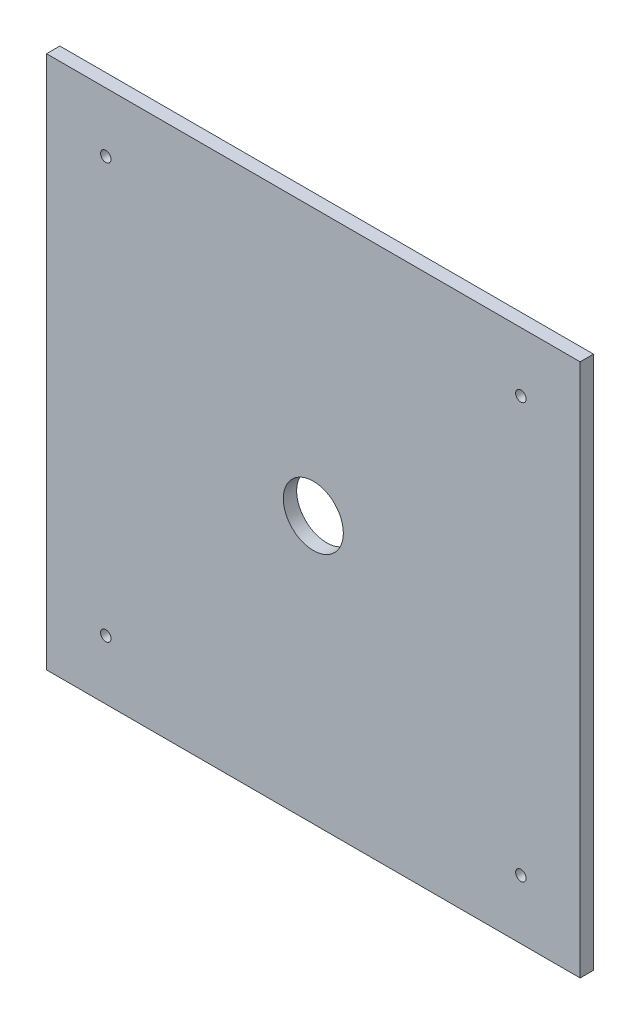
ISO-10303-21;
HEADER;
FILE_DESCRIPTION(('STEP AP214'),'2;1');
FILE_NAME('part.step','',(''),(''),'','','');
FILE_SCHEMA(('AUTOMOTIVE_DESIGN { 1 0 10303 214 1 1 1 1 }'));
ENDSEC;
DATA;
#1=APPLICATION_CONTEXT('core data for automotive mechanical design processes');
#2=APPLICATION_PROTOCOL_DEFINITION('international standard','automotive_design',2000,#1);
#3=PRODUCT_CONTEXT('',#1,'mechanical');
#4=PRODUCT('Part','Part','',(#3));
#5=PRODUCT_RELATED_PRODUCT_CATEGORY('part','',(#4));
#6=PRODUCT_DEFINITION_FORMATION('','',#4);
#7=PRODUCT_DEFINITION_CONTEXT('part definition',#1,'design');
#8=PRODUCT_DEFINITION('design','',#6,#7);
#9=PRODUCT_DEFINITION_SHAPE('','',#8);
#10=(LENGTH_UNIT() NAMED_UNIT(*) SI_UNIT(.MILLI.,.METRE.));
#11=(NAMED_UNIT(*) PLANE_ANGLE_UNIT() SI_UNIT($,.RADIAN.));
#12=(NAMED_UNIT(*) SI_UNIT($,.STERADIAN.) SOLID_ANGLE_UNIT());
#13=UNCERTAINTY_MEASURE_WITH_UNIT(LENGTH_MEASURE(1.E-05),#10,'distance_accuracy_value','');
#14=(GEOMETRIC_REPRESENTATION_CONTEXT(3) GLOBAL_UNCERTAINTY_ASSIGNED_CONTEXT((#13)) GLOBAL_UNIT_ASSIGNED_CONTEXT((#10,
#11,#12)) REPRESENTATION_CONTEXT('',''));
#15=CARTESIAN_POINT('',(0.,0.,0.));
#16=DIRECTION('',(0.,0.,1.));
#17=DIRECTION('',(1.,0.,0.));
#18=AXIS2_PLACEMENT_3D('',#15,#16,#17);
#19=CARTESIAN_POINT('',(0.,0.,0.));
#20=DIRECTION('',(0.,0.,1.));
#21=DIRECTION('',(1.,0.,0.));
#22=AXIS2_PLACEMENT_3D('',#19,#20,#21);
#23=PLANE('',#22);
#24=CARTESIAN_POINT('',(-98.7828173317607,98.7828173317607,0.));
#25=DIRECTION('',(0.,0.,-1.));
#26=DIRECTION('',(-1.,0.,0.));
#27=AXIS2_PLACEMENT_3D('',#24,#25,#26);
#28=CIRCLE('',#27,2.4892);
#29=CARTESIAN_POINT('',(-101.272017331761,98.7828173317607,0.));
#30=VERTEX_POINT('',#29);
#31=EDGE_CURVE('E134',#30,#30,#28,.T.);
#32=ORIENTED_EDGE('',*,*,#31,.F.);
#33=EDGE_LOOP('',(#32));
#34=FACE_BOUND('',#33,.T.);
#35=CARTESIAN_POINT('',(-98.7828173317607,-98.7828173317607,0.));
#36=DIRECTION('',(0.,0.,-1.));
#37=DIRECTION('',(-1.,0.,0.));
#38=AXIS2_PLACEMENT_3D('',#35,#36,#37);
#39=CIRCLE('',#38,2.48919999999998);
#40=CARTESIAN_POINT('',(-101.272017331761,-98.7828173317607,0.));
#41=VERTEX_POINT('',#40);
#42=EDGE_CURVE('E128',#41,#41,#39,.T.);
#43=ORIENTED_EDGE('',*,*,#42,.F.);
#44=EDGE_LOOP('',(#43));
#45=FACE_BOUND('',#44,.T.);
#46=CARTESIAN_POINT('',(98.7828173317607,-98.7828173317607,0.));
#47=DIRECTION('',(0.,0.,-1.));
#48=DIRECTION('',(-1.,0.,0.));
#49=AXIS2_PLACEMENT_3D('',#46,#47,#48);
#50=CIRCLE('',#49,2.48919999999998);
#51=CARTESIAN_POINT('',(96.2936173317607,-98.7828173317607,0.));
#52=VERTEX_POINT('',#51);
#53=EDGE_CURVE('E122',#52,#52,#50,.T.);
#54=ORIENTED_EDGE('',*,*,#53,.F.);
#55=EDGE_LOOP('',(#54));
#56=FACE_BOUND('',#55,.T.);
#57=DIRECTION('',(1.,0.,0.));
#58=VECTOR('',#57,1.);
#59=CARTESIAN_POINT('',(0.,-127.,0.));
#60=LINE('',#59,#58);
#61=CARTESIAN_POINT('',(-127.,-127.,0.));
#62=VERTEX_POINT('',#61);
#63=CARTESIAN_POINT('',(127.,-127.,0.));
#64=VERTEX_POINT('',#63);
#65=EDGE_CURVE('E104',#62,#64,#60,.T.);
#66=ORIENTED_EDGE('',*,*,#65,.F.);
#67=DIRECTION('',(0.,1.,0.));
#68=VECTOR('',#67,1.);
#69=CARTESIAN_POINT('',(-127.,0.,0.));
#70=LINE('',#69,#68);
#71=CARTESIAN_POINT('',(-127.,127.,0.));
#72=VERTEX_POINT('',#71);
#73=EDGE_CURVE('E110',#62,#72,#70,.T.);
#74=ORIENTED_EDGE('',*,*,#73,.T.);
#75=DIRECTION('',(1.,0.,0.));
#76=VECTOR('',#75,1.);
#77=CARTESIAN_POINT('',(0.,127.,0.));
#78=LINE('',#77,#76);
#79=CARTESIAN_POINT('',(127.,127.,0.));
#80=VERTEX_POINT('',#79);
#81=EDGE_CURVE('E108',#72,#80,#78,.T.);
#82=ORIENTED_EDGE('',*,*,#81,.T.);
#83=DIRECTION('',(0.,1.,0.));
#84=VECTOR('',#83,1.);
#85=CARTESIAN_POINT('',(127.,0.,0.));
#86=LINE('',#85,#84);
#87=EDGE_CURVE('E92',#64,#80,#86,.T.);
#88=ORIENTED_EDGE('',*,*,#87,.F.);
#89=EDGE_LOOP('',(#66,#74,#82,#88));
#90=FACE_BOUND('',#89,.T.);
#91=CARTESIAN_POINT('',(0.,0.,0.));
#92=DIRECTION('',(0.,0.,1.));
#93=DIRECTION('',(1.,0.,0.));
#94=AXIS2_PLACEMENT_3D('',#91,#92,#93);
#95=CIRCLE('',#94,14.2875);
#96=CARTESIAN_POINT('',(14.2875,0.,0.));
#97=VERTEX_POINT('',#96);
#98=EDGE_CURVE('E113',#97,#97,#95,.T.);
#99=ORIENTED_EDGE('',*,*,#98,.T.);
#100=EDGE_LOOP('',(#99));
#101=FACE_BOUND('',#100,.T.);
#102=CARTESIAN_POINT('',(98.7828173317608,98.7828173317606,0.));
#103=DIRECTION('',(0.,0.,-1.));
#104=DIRECTION('',(-1.,0.,0.));
#105=AXIS2_PLACEMENT_3D('',#102,#103,#104);
#106=CIRCLE('',#105,2.4892);
#107=CARTESIAN_POINT('',(96.2936173317608,98.7828173317606,0.));
#108=VERTEX_POINT('',#107);
#109=EDGE_CURVE('E140',#108,#108,#106,.T.);
#110=ORIENTED_EDGE('',*,*,#109,.F.);
#111=EDGE_LOOP('',(#110));
#112=FACE_BOUND('',#111,.T.);
#113=ADVANCED_FACE('F36',(#34,#45,#56,#90,#101,#112),#23,.F.);
#114=CARTESIAN_POINT('',(0.,-127.,6.35));
#115=DIRECTION('',(0.,1.,0.));
#116=DIRECTION('',(-1.,0.,0.));
#117=AXIS2_PLACEMENT_3D('',#114,#115,#116);
#118=PLANE('',#117);
#119=ORIENTED_EDGE('',*,*,#65,.T.);
#120=DIRECTION('',(0.,0.,-1.));
#121=VECTOR('',#120,1.);
#122=CARTESIAN_POINT('',(127.,-127.,6.35));
#123=LINE('',#122,#121);
#124=CARTESIAN_POINT('',(127.,-127.,6.35));
#125=VERTEX_POINT('',#124);
#126=EDGE_CURVE('E11',#125,#64,#123,.T.);
#127=ORIENTED_EDGE('',*,*,#126,.F.);
#128=DIRECTION('',(1.,0.,0.));
#129=VECTOR('',#128,1.);
#130=CARTESIAN_POINT('',(0.,-127.,6.35));
#131=LINE('',#130,#129);
#132=CARTESIAN_POINT('',(-127.,-127.,6.35));
#133=VERTEX_POINT('',#132);
#134=EDGE_CURVE('E87',#133,#125,#131,.T.);
#135=ORIENTED_EDGE('',*,*,#134,.F.);
#136=DIRECTION('',(0.,0.,-1.));
#137=VECTOR('',#136,1.);
#138=CARTESIAN_POINT('',(-127.,-127.,6.35));
#139=LINE('',#138,#137);
#140=EDGE_CURVE('E53',#133,#62,#139,.T.);
#141=ORIENTED_EDGE('',*,*,#140,.T.);
#142=EDGE_LOOP('',(#119,#127,#135,#141));
#143=FACE_BOUND('',#142,.T.);
#144=ADVANCED_FACE('F38',(#143),#118,.F.);
#145=CARTESIAN_POINT('',(127.,0.,6.35));
#146=DIRECTION('',(-1.,0.,0.));
#147=DIRECTION('',(0.,-1.,0.));
#148=AXIS2_PLACEMENT_3D('',#145,#146,#147);
#149=PLANE('',#148);
#150=ORIENTED_EDGE('',*,*,#87,.T.);
#151=DIRECTION('',(0.,0.,-1.));
#152=VECTOR('',#151,1.);
#153=CARTESIAN_POINT('',(127.,127.,6.35));
#154=LINE('',#153,#152);
#155=CARTESIAN_POINT('',(127.,127.,6.35));
#156=VERTEX_POINT('',#155);
#157=EDGE_CURVE('E45',#156,#80,#154,.T.);
#158=ORIENTED_EDGE('',*,*,#157,.F.);
#159=DIRECTION('',(0.,1.,0.));
#160=VECTOR('',#159,1.);
#161=CARTESIAN_POINT('',(127.,0.,6.35));
#162=LINE('',#161,#160);
#163=EDGE_CURVE('E78',#125,#156,#162,.T.);
#164=ORIENTED_EDGE('',*,*,#163,.F.);
#165=ORIENTED_EDGE('',*,*,#126,.T.);
#166=EDGE_LOOP('',(#150,#158,#164,#165));
#167=FACE_BOUND('',#166,.T.);
#168=ADVANCED_FACE('F91',(#167),#149,.F.);
#169=CARTESIAN_POINT('',(0.,127.,6.35));
#170=DIRECTION('',(0.,1.,0.));
#171=DIRECTION('',(0.,0.,1.));
#172=AXIS2_PLACEMENT_3D('',#169,#170,#171);
#173=PLANE('',#172);
#174=ORIENTED_EDGE('',*,*,#81,.F.);
#175=DIRECTION('',(0.,0.,-1.));
#176=VECTOR('',#175,1.);
#177=CARTESIAN_POINT('',(-127.,127.,6.35));
#178=LINE('',#177,#176);
#179=CARTESIAN_POINT('',(-127.,127.,6.35));
#180=VERTEX_POINT('',#179);
#181=EDGE_CURVE('E67',#180,#72,#178,.T.);
#182=ORIENTED_EDGE('',*,*,#181,.F.);
#183=DIRECTION('',(1.,0.,0.));
#184=VECTOR('',#183,1.);
#185=CARTESIAN_POINT('',(0.,127.,6.35));
#186=LINE('',#185,#184);
#187=EDGE_CURVE('E86',#180,#156,#186,.T.);
#188=ORIENTED_EDGE('',*,*,#187,.T.);
#189=ORIENTED_EDGE('',*,*,#157,.T.);
#190=EDGE_LOOP('',(#174,#182,#188,#189));
#191=FACE_BOUND('',#190,.T.);
#192=ADVANCED_FACE('F95',(#191),#173,.T.);
#193=CARTESIAN_POINT('',(-127.,0.,6.35));
#194=DIRECTION('',(-1.,0.,0.));
#195=DIRECTION('',(0.,-1.,0.));
#196=AXIS2_PLACEMENT_3D('',#193,#194,#195);
#197=PLANE('',#196);
#198=ORIENTED_EDGE('',*,*,#73,.F.);
#199=ORIENTED_EDGE('',*,*,#140,.F.);
#200=DIRECTION('',(0.,1.,0.));
#201=VECTOR('',#200,1.);
#202=CARTESIAN_POINT('',(-127.,0.,6.35));
#203=LINE('',#202,#201);
#204=EDGE_CURVE('E96',#133,#180,#203,.T.);
#205=ORIENTED_EDGE('',*,*,#204,.T.);
#206=ORIENTED_EDGE('',*,*,#181,.T.);
#207=EDGE_LOOP('',(#198,#199,#205,#206));
#208=FACE_BOUND('',#207,.T.);
#209=ADVANCED_FACE('F160',(#208),#197,.T.);
#210=CARTESIAN_POINT('',(0.,0.,6.35));
#211=DIRECTION('',(0.,0.,-1.));
#212=DIRECTION('',(-1.,0.,0.));
#213=AXIS2_PLACEMENT_3D('',#210,#211,#212);
#214=CYLINDRICAL_SURFACE('',#213,14.2875);
#215=CARTESIAN_POINT('',(0.,0.,6.35));
#216=DIRECTION('',(0.,0.,1.));
#217=DIRECTION('',(1.,0.,0.));
#218=AXIS2_PLACEMENT_3D('',#215,#216,#217);
#219=CIRCLE('',#218,14.2875);
#220=CARTESIAN_POINT('',(14.2875,0.,6.35));
#221=VERTEX_POINT('',#220);
#222=EDGE_CURVE('E98',#221,#221,#219,.T.);
#223=ORIENTED_EDGE('',*,*,#222,.T.);
#224=EDGE_LOOP('',(#223));
#225=FACE_BOUND('',#224,.T.);
#226=ORIENTED_EDGE('',*,*,#98,.F.);
#227=EDGE_LOOP('',(#226));
#228=FACE_BOUND('',#227,.T.);
#229=ADVANCED_FACE('F157',(#225,#228),#214,.F.);
#230=CARTESIAN_POINT('',(0.,0.,6.35));
#231=DIRECTION('',(0.,0.,1.));
#232=DIRECTION('',(1.,0.,0.));
#233=AXIS2_PLACEMENT_3D('',#230,#231,#232);
#234=PLANE('',#233);
#235=CARTESIAN_POINT('',(98.7828173317608,98.7828173317606,6.34999999999999));
#236=DIRECTION('',(0.,0.,-1.));
#237=DIRECTION('',(-1.,0.,0.));
#238=AXIS2_PLACEMENT_3D('',#235,#236,#237);
#239=CIRCLE('',#238,2.48919999999998);
#240=CARTESIAN_POINT('',(96.2936173317608,98.7828173317606,6.34999999999999));
#241=VERTEX_POINT('',#240);
#242=EDGE_CURVE('E137',#241,#241,#239,.T.);
#243=ORIENTED_EDGE('',*,*,#242,.T.);
#244=EDGE_LOOP('',(#243));
#245=FACE_BOUND('',#244,.T.);
#246=CARTESIAN_POINT('',(-98.7828173317607,98.7828173317607,6.34999999999999));
#247=DIRECTION('',(0.,0.,-1.));
#248=DIRECTION('',(-1.,0.,0.));
#249=AXIS2_PLACEMENT_3D('',#246,#247,#248);
#250=CIRCLE('',#249,2.48919999999998);
#251=CARTESIAN_POINT('',(-101.272017331761,98.7828173317607,6.34999999999999));
#252=VERTEX_POINT('',#251);
#253=EDGE_CURVE('E131',#252,#252,#250,.T.);
#254=ORIENTED_EDGE('',*,*,#253,.T.);
#255=EDGE_LOOP('',(#254));
#256=FACE_BOUND('',#255,.T.);
#257=CARTESIAN_POINT('',(-98.7828173317607,-98.7828173317607,6.34999999999999));
#258=DIRECTION('',(0.,0.,-1.));
#259=DIRECTION('',(-1.,0.,0.));
#260=AXIS2_PLACEMENT_3D('',#257,#258,#259);
#261=CIRCLE('',#260,2.48919999999998);
#262=CARTESIAN_POINT('',(-101.272017331761,-98.7828173317607,6.34999999999999));
#263=VERTEX_POINT('',#262);
#264=EDGE_CURVE('E125',#263,#263,#261,.T.);
#265=ORIENTED_EDGE('',*,*,#264,.T.);
#266=EDGE_LOOP('',(#265));
#267=FACE_BOUND('',#266,.T.);
#268=CARTESIAN_POINT('',(98.7828173317607,-98.7828173317607,6.34999999999999));
#269=DIRECTION('',(0.,0.,-1.));
#270=DIRECTION('',(-1.,0.,0.));
#271=AXIS2_PLACEMENT_3D('',#268,#269,#270);
#272=CIRCLE('',#271,2.48919999999998);
#273=CARTESIAN_POINT('',(96.2936173317607,-98.7828173317607,6.34999999999999));
#274=VERTEX_POINT('',#273);
#275=EDGE_CURVE('E106',#274,#274,#272,.T.);
#276=ORIENTED_EDGE('',*,*,#275,.T.);
#277=EDGE_LOOP('',(#276));
#278=FACE_BOUND('',#277,.T.);
#279=ORIENTED_EDGE('',*,*,#134,.T.);
#280=ORIENTED_EDGE('',*,*,#163,.T.);
#281=ORIENTED_EDGE('',*,*,#187,.F.);
#282=ORIENTED_EDGE('',*,*,#204,.F.);
#283=EDGE_LOOP('',(#279,#280,#281,#282));
#284=FACE_BOUND('',#283,.T.);
#285=ORIENTED_EDGE('',*,*,#222,.F.);
#286=EDGE_LOOP('',(#285));
#287=FACE_BOUND('',#286,.T.);
#288=ADVANCED_FACE('F82',(#245,#256,#267,#278,#284,#287),#234,.T.);
#289=CARTESIAN_POINT('',(98.7828173317607,-98.7828173317607,0.));
#290=DIRECTION('',(0.,0.,-1.));
#291=DIRECTION('',(-1.,0.,0.));
#292=AXIS2_PLACEMENT_3D('',#289,#290,#291);
#293=CYLINDRICAL_SURFACE('',#292,2.48919999999998);
#294=ORIENTED_EDGE('',*,*,#275,.F.);
#295=EDGE_LOOP('',(#294));
#296=FACE_BOUND('',#295,.T.);
#297=ORIENTED_EDGE('',*,*,#53,.T.);
#298=EDGE_LOOP('',(#297));
#299=FACE_BOUND('',#298,.T.);
#300=ADVANCED_FACE('F188',(#296,#299),#293,.F.);
#301=CARTESIAN_POINT('',(-98.7828173317607,-98.7828173317607,0.));
#302=DIRECTION('',(0.,0.,-1.));
#303=DIRECTION('',(-1.,0.,0.));
#304=AXIS2_PLACEMENT_3D('',#301,#302,#303);
#305=CYLINDRICAL_SURFACE('',#304,2.48919999999998);
#306=ORIENTED_EDGE('',*,*,#264,.F.);
#307=EDGE_LOOP('',(#306));
#308=FACE_BOUND('',#307,.T.);
#309=ORIENTED_EDGE('',*,*,#42,.T.);
#310=EDGE_LOOP('',(#309));
#311=FACE_BOUND('',#310,.T.);
#312=ADVANCED_FACE('F195',(#308,#311),#305,.F.);
#313=CARTESIAN_POINT('',(-98.7828173317607,98.7828173317607,0.));
#314=DIRECTION('',(0.,0.,-1.));
#315=DIRECTION('',(-1.,0.,0.));
#316=AXIS2_PLACEMENT_3D('',#313,#314,#315);
#317=CYLINDRICAL_SURFACE('',#316,2.48919999999999);
#318=ORIENTED_EDGE('',*,*,#253,.F.);
#319=EDGE_LOOP('',(#318));
#320=FACE_BOUND('',#319,.T.);
#321=ORIENTED_EDGE('',*,*,#31,.T.);
#322=EDGE_LOOP('',(#321));
#323=FACE_BOUND('',#322,.T.);
#324=ADVANCED_FACE('F202',(#320,#323),#317,.F.);
#325=CARTESIAN_POINT('',(98.7828173317608,98.7828173317606,0.));
#326=DIRECTION('',(0.,0.,-1.));
#327=DIRECTION('',(-1.,0.,0.));
#328=AXIS2_PLACEMENT_3D('',#325,#326,#327);
#329=CYLINDRICAL_SURFACE('',#328,2.48919999999999);
#330=ORIENTED_EDGE('',*,*,#242,.F.);
#331=EDGE_LOOP('',(#330));
#332=FACE_BOUND('',#331,.T.);
#333=ORIENTED_EDGE('',*,*,#109,.T.);
#334=EDGE_LOOP('',(#333));
#335=FACE_BOUND('',#334,.T.);
#336=ADVANCED_FACE('F144',(#332,#335),#329,.F.);
#337=CLOSED_SHELL('',(#113,#144,#168,#192,#209,#229,#288,#300,#312,#324,#336));
#338=MANIFOLD_SOLID_BREP('B2',#337);
#339=ADVANCED_BREP_SHAPE_REPRESENTATION('',(#18,#338),#14);
#340=SHAPE_DEFINITION_REPRESENTATION(#9,#339);
ENDSEC;
END-ISO-10303-21;
